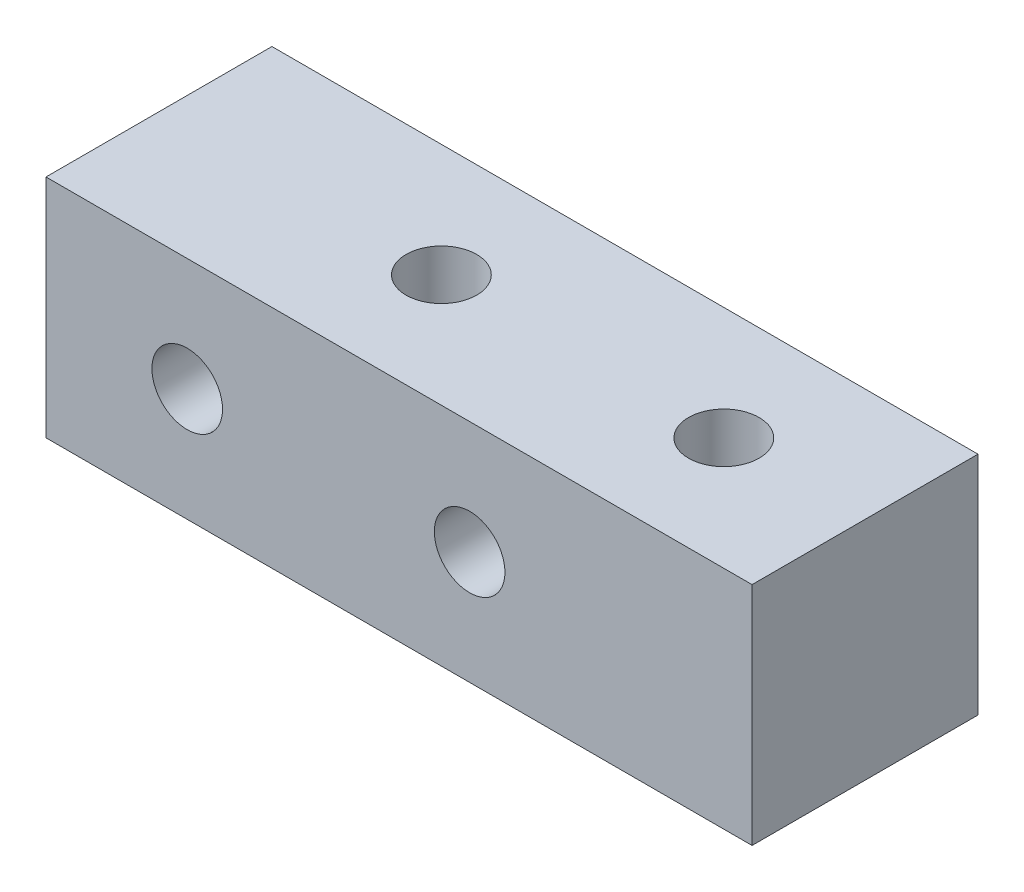
ISO-10303-21;
HEADER;
FILE_DESCRIPTION(('STEP AP214'),'2;1');
FILE_NAME('part.step','',(''),(''),'','','');
FILE_SCHEMA(('AUTOMOTIVE_DESIGN { 1 0 10303 214 1 1 1 1 }'));
ENDSEC;
DATA;
#1=APPLICATION_CONTEXT('core data for automotive mechanical design processes');
#2=APPLICATION_PROTOCOL_DEFINITION('international standard','automotive_design',2000,#1);
#3=PRODUCT_CONTEXT('',#1,'mechanical');
#4=PRODUCT('Part','Part','',(#3));
#5=PRODUCT_RELATED_PRODUCT_CATEGORY('part','',(#4));
#6=PRODUCT_DEFINITION_FORMATION('','',#4);
#7=PRODUCT_DEFINITION_CONTEXT('part definition',#1,'design');
#8=PRODUCT_DEFINITION('design','',#6,#7);
#9=PRODUCT_DEFINITION_SHAPE('','',#8);
#10=(LENGTH_UNIT() NAMED_UNIT(*) SI_UNIT(.MILLI.,.METRE.));
#11=(NAMED_UNIT(*) PLANE_ANGLE_UNIT() SI_UNIT($,.RADIAN.));
#12=(NAMED_UNIT(*) SI_UNIT($,.STERADIAN.) SOLID_ANGLE_UNIT());
#13=UNCERTAINTY_MEASURE_WITH_UNIT(LENGTH_MEASURE(1.E-05),#10,'distance_accuracy_value','');
#14=(GEOMETRIC_REPRESENTATION_CONTEXT(3) GLOBAL_UNCERTAINTY_ASSIGNED_CONTEXT((#13)) GLOBAL_UNIT_ASSIGNED_CONTEXT((#10,
#11,#12)) REPRESENTATION_CONTEXT('',''));
#15=CARTESIAN_POINT('',(0.,0.,0.));
#16=DIRECTION('',(0.,0.,1.));
#17=DIRECTION('',(1.,0.,0.));
#18=AXIS2_PLACEMENT_3D('',#15,#16,#17);
#19=CARTESIAN_POINT('',(-12.5,-4.,8.));
#20=DIRECTION('',(1.,0.,0.));
#21=DIRECTION('',(0.,0.,-1.));
#22=AXIS2_PLACEMENT_3D('',#19,#20,#21);
#23=PLANE('',#22);
#24=DIRECTION('',(0.,-1.,0.));
#25=VECTOR('',#24,1.);
#26=CARTESIAN_POINT('',(-12.5,-4.,0.));
#27=LINE('',#26,#25);
#28=CARTESIAN_POINT('',(-12.5,4.,0.));
#29=VERTEX_POINT('',#28);
#30=CARTESIAN_POINT('',(-12.5,-4.,0.));
#31=VERTEX_POINT('',#30);
#32=EDGE_CURVE('E99',#29,#31,#27,.T.);
#33=ORIENTED_EDGE('',*,*,#32,.T.);
#34=DIRECTION('',(0.,0.,-1.));
#35=VECTOR('',#34,1.);
#36=CARTESIAN_POINT('',(-12.5,-4.,8.));
#37=LINE('',#36,#35);
#38=CARTESIAN_POINT('',(-12.5,-4.,8.));
#39=VERTEX_POINT('',#38);
#40=EDGE_CURVE('E11',#39,#31,#37,.T.);
#41=ORIENTED_EDGE('',*,*,#40,.F.);
#42=DIRECTION('',(0.,-1.,0.));
#43=VECTOR('',#42,1.);
#44=CARTESIAN_POINT('',(-12.5,-4.,8.));
#45=LINE('',#44,#43);
#46=CARTESIAN_POINT('',(-12.5,4.,8.));
#47=VERTEX_POINT('',#46);
#48=EDGE_CURVE('E87',#47,#39,#45,.T.);
#49=ORIENTED_EDGE('',*,*,#48,.F.);
#50=DIRECTION('',(0.,0.,-1.));
#51=VECTOR('',#50,1.);
#52=CARTESIAN_POINT('',(-12.5,4.,8.));
#53=LINE('',#52,#51);
#54=EDGE_CURVE('E95',#47,#29,#53,.T.);
#55=ORIENTED_EDGE('',*,*,#54,.T.);
#56=EDGE_LOOP('',(#33,#41,#49,#55));
#57=FACE_BOUND('',#56,.T.);
#58=ADVANCED_FACE('F36',(#57),#23,.F.);
#59=CARTESIAN_POINT('',(12.5,-4.,8.));
#60=DIRECTION('',(0.,1.,0.));
#61=DIRECTION('',(-1.,0.,0.));
#62=AXIS2_PLACEMENT_3D('',#59,#60,#61);
#63=PLANE('',#62);
#64=CARTESIAN_POINT('',(-2.5,-4.,4.));
#65=DIRECTION('',(0.,1.,0.));
#66=DIRECTION('',(0.,0.,1.));
#67=AXIS2_PLACEMENT_3D('',#64,#65,#66);
#68=CIRCLE('',#67,1.25);
#69=CARTESIAN_POINT('',(-2.5,-4.,5.25));
#70=VERTEX_POINT('',#69);
#71=EDGE_CURVE('E130',#70,#70,#68,.T.);
#72=ORIENTED_EDGE('',*,*,#71,.T.);
#73=EDGE_LOOP('',(#72));
#74=FACE_BOUND('',#73,.T.);
#75=CARTESIAN_POINT('',(7.5,-4.,4.));
#76=DIRECTION('',(0.,1.,0.));
#77=DIRECTION('',(0.,0.,1.));
#78=AXIS2_PLACEMENT_3D('',#75,#76,#77);
#79=CIRCLE('',#78,1.25);
#80=CARTESIAN_POINT('',(7.5,-4.,5.25));
#81=VERTEX_POINT('',#80);
#82=EDGE_CURVE('E124',#81,#81,#79,.T.);
#83=ORIENTED_EDGE('',*,*,#82,.T.);
#84=EDGE_LOOP('',(#83));
#85=FACE_BOUND('',#84,.T.);
#86=DIRECTION('',(1.,0.,0.));
#87=VECTOR('',#86,1.);
#88=CARTESIAN_POINT('',(12.5,-4.,0.));
#89=LINE('',#88,#87);
#90=CARTESIAN_POINT('',(12.5,-4.,0.));
#91=VERTEX_POINT('',#90);
#92=EDGE_CURVE('E91',#31,#91,#89,.T.);
#93=ORIENTED_EDGE('',*,*,#92,.T.);
#94=DIRECTION('',(0.,0.,-1.));
#95=VECTOR('',#94,1.);
#96=CARTESIAN_POINT('',(12.5,-4.,8.));
#97=LINE('',#96,#95);
#98=CARTESIAN_POINT('',(12.5,-4.,8.));
#99=VERTEX_POINT('',#98);
#100=EDGE_CURVE('E44',#99,#91,#97,.T.);
#101=ORIENTED_EDGE('',*,*,#100,.F.);
#102=DIRECTION('',(1.,0.,0.));
#103=VECTOR('',#102,1.);
#104=CARTESIAN_POINT('',(12.5,-4.,8.));
#105=LINE('',#104,#103);
#106=EDGE_CURVE('E82',#39,#99,#105,.T.);
#107=ORIENTED_EDGE('',*,*,#106,.F.);
#108=ORIENTED_EDGE('',*,*,#40,.T.);
#109=EDGE_LOOP('',(#93,#101,#107,#108));
#110=FACE_BOUND('',#109,.T.);
#111=ADVANCED_FACE('F90',(#74,#85,#110),#63,.F.);
#112=CARTESIAN_POINT('',(12.5,-4.,8.));
#113=DIRECTION('',(-1.,0.,0.));
#114=DIRECTION('',(0.,0.,1.));
#115=AXIS2_PLACEMENT_3D('',#112,#113,#114);
#116=PLANE('',#115);
#117=DIRECTION('',(0.,1.,0.));
#118=VECTOR('',#117,1.);
#119=CARTESIAN_POINT('',(12.5,-4.,0.));
#120=LINE('',#119,#118);
#121=CARTESIAN_POINT('',(12.5,4.,0.));
#122=VERTEX_POINT('',#121);
#123=EDGE_CURVE('E69',#91,#122,#120,.T.);
#124=ORIENTED_EDGE('',*,*,#123,.T.);
#125=DIRECTION('',(0.,0.,-1.));
#126=VECTOR('',#125,1.);
#127=CARTESIAN_POINT('',(12.5,4.,8.));
#128=LINE('',#127,#126);
#129=CARTESIAN_POINT('',(12.5,4.,8.));
#130=VERTEX_POINT('',#129);
#131=EDGE_CURVE('E92',#130,#122,#128,.T.);
#132=ORIENTED_EDGE('',*,*,#131,.F.);
#133=DIRECTION('',(0.,1.,0.));
#134=VECTOR('',#133,1.);
#135=CARTESIAN_POINT('',(12.5,-4.,8.));
#136=LINE('',#135,#134);
#137=EDGE_CURVE('E85',#99,#130,#136,.T.);
#138=ORIENTED_EDGE('',*,*,#137,.F.);
#139=ORIENTED_EDGE('',*,*,#100,.T.);
#140=EDGE_LOOP('',(#124,#132,#138,#139));
#141=FACE_BOUND('',#140,.T.);
#142=ADVANCED_FACE('F93',(#141),#116,.F.);
#143=CARTESIAN_POINT('',(12.5,4.,8.));
#144=DIRECTION('',(0.,-1.,0.));
#145=DIRECTION('',(1.,0.,0.));
#146=AXIS2_PLACEMENT_3D('',#143,#144,#145);
#147=PLANE('',#146);
#148=CARTESIAN_POINT('',(-2.5,4.,4.));
#149=DIRECTION('',(0.,1.,0.));
#150=DIRECTION('',(0.,0.,1.));
#151=AXIS2_PLACEMENT_3D('',#148,#149,#150);
#152=CIRCLE('',#151,1.25);
#153=CARTESIAN_POINT('',(-2.5,4.,5.25));
#154=VERTEX_POINT('',#153);
#155=EDGE_CURVE('E133',#154,#154,#152,.T.);
#156=ORIENTED_EDGE('',*,*,#155,.F.);
#157=EDGE_LOOP('',(#156));
#158=FACE_BOUND('',#157,.T.);
#159=CARTESIAN_POINT('',(7.5,4.,4.));
#160=DIRECTION('',(0.,1.,0.));
#161=DIRECTION('',(0.,0.,1.));
#162=AXIS2_PLACEMENT_3D('',#159,#160,#161);
#163=CIRCLE('',#162,1.25);
#164=CARTESIAN_POINT('',(7.5,4.,5.25));
#165=VERTEX_POINT('',#164);
#166=EDGE_CURVE('E127',#165,#165,#163,.T.);
#167=ORIENTED_EDGE('',*,*,#166,.F.);
#168=EDGE_LOOP('',(#167));
#169=FACE_BOUND('',#168,.T.);
#170=DIRECTION('',(-1.,0.,0.));
#171=VECTOR('',#170,1.);
#172=CARTESIAN_POINT('',(12.5,4.,0.));
#173=LINE('',#172,#171);
#174=EDGE_CURVE('E75',#122,#29,#173,.T.);
#175=ORIENTED_EDGE('',*,*,#174,.T.);
#176=ORIENTED_EDGE('',*,*,#54,.F.);
#177=DIRECTION('',(-1.,0.,0.));
#178=VECTOR('',#177,1.);
#179=CARTESIAN_POINT('',(12.5,4.,8.));
#180=LINE('',#179,#178);
#181=EDGE_CURVE('E52',#130,#47,#180,.T.);
#182=ORIENTED_EDGE('',*,*,#181,.F.);
#183=ORIENTED_EDGE('',*,*,#131,.T.);
#184=EDGE_LOOP('',(#175,#176,#182,#183));
#185=FACE_BOUND('',#184,.T.);
#186=ADVANCED_FACE('F107',(#158,#169,#185),#147,.F.);
#187=CARTESIAN_POINT('',(0.,0.,8.));
#188=DIRECTION('',(0.,0.,1.));
#189=DIRECTION('',(1.,0.,0.));
#190=AXIS2_PLACEMENT_3D('',#187,#188,#189);
#191=PLANE('',#190);
#192=CARTESIAN_POINT('',(2.5,0.,8.));
#193=DIRECTION('',(0.,0.,1.));
#194=DIRECTION('',(1.,0.,0.));
#195=AXIS2_PLACEMENT_3D('',#192,#193,#194);
#196=CIRCLE('',#195,1.25);
#197=CARTESIAN_POINT('',(3.75,0.,8.));
#198=VERTEX_POINT('',#197);
#199=EDGE_CURVE('E121',#198,#198,#196,.T.);
#200=ORIENTED_EDGE('',*,*,#199,.F.);
#201=EDGE_LOOP('',(#200));
#202=FACE_BOUND('',#201,.T.);
#203=CARTESIAN_POINT('',(-7.5,0.,8.));
#204=DIRECTION('',(0.,0.,1.));
#205=DIRECTION('',(1.,0.,0.));
#206=AXIS2_PLACEMENT_3D('',#203,#204,#205);
#207=CIRCLE('',#206,1.25);
#208=CARTESIAN_POINT('',(-6.25,0.,8.));
#209=VERTEX_POINT('',#208);
#210=EDGE_CURVE('E115',#209,#209,#207,.T.);
#211=ORIENTED_EDGE('',*,*,#210,.F.);
#212=EDGE_LOOP('',(#211));
#213=FACE_BOUND('',#212,.T.);
#214=ORIENTED_EDGE('',*,*,#48,.T.);
#215=ORIENTED_EDGE('',*,*,#106,.T.);
#216=ORIENTED_EDGE('',*,*,#137,.T.);
#217=ORIENTED_EDGE('',*,*,#181,.T.);
#218=EDGE_LOOP('',(#214,#215,#216,#217));
#219=FACE_BOUND('',#218,.T.);
#220=ADVANCED_FACE('F83',(#202,#213,#219),#191,.T.);
#221=CARTESIAN_POINT('',(0.,0.,0.));
#222=DIRECTION('',(0.,0.,1.));
#223=DIRECTION('',(1.,0.,0.));
#224=AXIS2_PLACEMENT_3D('',#221,#222,#223);
#225=PLANE('',#224);
#226=CARTESIAN_POINT('',(2.5,0.,0.));
#227=DIRECTION('',(0.,0.,1.));
#228=DIRECTION('',(1.,0.,0.));
#229=AXIS2_PLACEMENT_3D('',#226,#227,#228);
#230=CIRCLE('',#229,1.25);
#231=CARTESIAN_POINT('',(3.75,0.,0.));
#232=VERTEX_POINT('',#231);
#233=EDGE_CURVE('E118',#232,#232,#230,.T.);
#234=ORIENTED_EDGE('',*,*,#233,.T.);
#235=EDGE_LOOP('',(#234));
#236=FACE_BOUND('',#235,.T.);
#237=CARTESIAN_POINT('',(-7.5,0.,0.));
#238=DIRECTION('',(0.,0.,1.));
#239=DIRECTION('',(1.,0.,0.));
#240=AXIS2_PLACEMENT_3D('',#237,#238,#239);
#241=CIRCLE('',#240,1.25);
#242=CARTESIAN_POINT('',(-6.25,0.,0.));
#243=VERTEX_POINT('',#242);
#244=EDGE_CURVE('E102',#243,#243,#241,.T.);
#245=ORIENTED_EDGE('',*,*,#244,.T.);
#246=EDGE_LOOP('',(#245));
#247=FACE_BOUND('',#246,.T.);
#248=ORIENTED_EDGE('',*,*,#32,.F.);
#249=ORIENTED_EDGE('',*,*,#174,.F.);
#250=ORIENTED_EDGE('',*,*,#123,.F.);
#251=ORIENTED_EDGE('',*,*,#92,.F.);
#252=EDGE_LOOP('',(#248,#249,#250,#251));
#253=FACE_BOUND('',#252,.T.);
#254=ADVANCED_FACE('F110',(#236,#247,#253),#225,.F.);
#255=CARTESIAN_POINT('',(-7.5,0.,8.));
#256=DIRECTION('',(0.,0.,1.));
#257=DIRECTION('',(1.,0.,0.));
#258=AXIS2_PLACEMENT_3D('',#255,#256,#257);
#259=CYLINDRICAL_SURFACE('',#258,1.25);
#260=ORIENTED_EDGE('',*,*,#244,.F.);
#261=EDGE_LOOP('',(#260));
#262=FACE_BOUND('',#261,.T.);
#263=ORIENTED_EDGE('',*,*,#210,.T.);
#264=EDGE_LOOP('',(#263));
#265=FACE_BOUND('',#264,.T.);
#266=ADVANCED_FACE('F155',(#262,#265),#259,.F.);
#267=CARTESIAN_POINT('',(2.5,0.,8.));
#268=DIRECTION('',(0.,0.,1.));
#269=DIRECTION('',(1.,0.,0.));
#270=AXIS2_PLACEMENT_3D('',#267,#268,#269);
#271=CYLINDRICAL_SURFACE('',#270,1.25);
#272=ORIENTED_EDGE('',*,*,#233,.F.);
#273=EDGE_LOOP('',(#272));
#274=FACE_BOUND('',#273,.T.);
#275=ORIENTED_EDGE('',*,*,#199,.T.);
#276=EDGE_LOOP('',(#275));
#277=FACE_BOUND('',#276,.T.);
#278=ADVANCED_FACE('F146',(#274,#277),#271,.F.);
#279=CARTESIAN_POINT('',(7.5,4.,4.));
#280=DIRECTION('',(0.,1.,0.));
#281=DIRECTION('',(0.,0.,1.));
#282=AXIS2_PLACEMENT_3D('',#279,#280,#281);
#283=CYLINDRICAL_SURFACE('',#282,1.25);
#284=ORIENTED_EDGE('',*,*,#82,.F.);
#285=EDGE_LOOP('',(#284));
#286=FACE_BOUND('',#285,.T.);
#287=ORIENTED_EDGE('',*,*,#166,.T.);
#288=EDGE_LOOP('',(#287));
#289=FACE_BOUND('',#288,.T.);
#290=ADVANCED_FACE('F144',(#286,#289),#283,.F.);
#291=CARTESIAN_POINT('',(-2.5,4.,4.));
#292=DIRECTION('',(0.,1.,0.));
#293=DIRECTION('',(0.,0.,1.));
#294=AXIS2_PLACEMENT_3D('',#291,#292,#293);
#295=CYLINDRICAL_SURFACE('',#294,1.25);
#296=ORIENTED_EDGE('',*,*,#71,.F.);
#297=EDGE_LOOP('',(#296));
#298=FACE_BOUND('',#297,.T.);
#299=ORIENTED_EDGE('',*,*,#155,.T.);
#300=EDGE_LOOP('',(#299));
#301=FACE_BOUND('',#300,.T.);
#302=ADVANCED_FACE('F137',(#298,#301),#295,.F.);
#303=CLOSED_SHELL('',(#58,#111,#142,#186,#220,#254,#266,#278,#290,#302));
#304=MANIFOLD_SOLID_BREP('B2',#303);
#305=ADVANCED_BREP_SHAPE_REPRESENTATION('',(#18,#304),#14);
#306=SHAPE_DEFINITION_REPRESENTATION(#9,#305);
ENDSEC;
END-ISO-10303-21;
